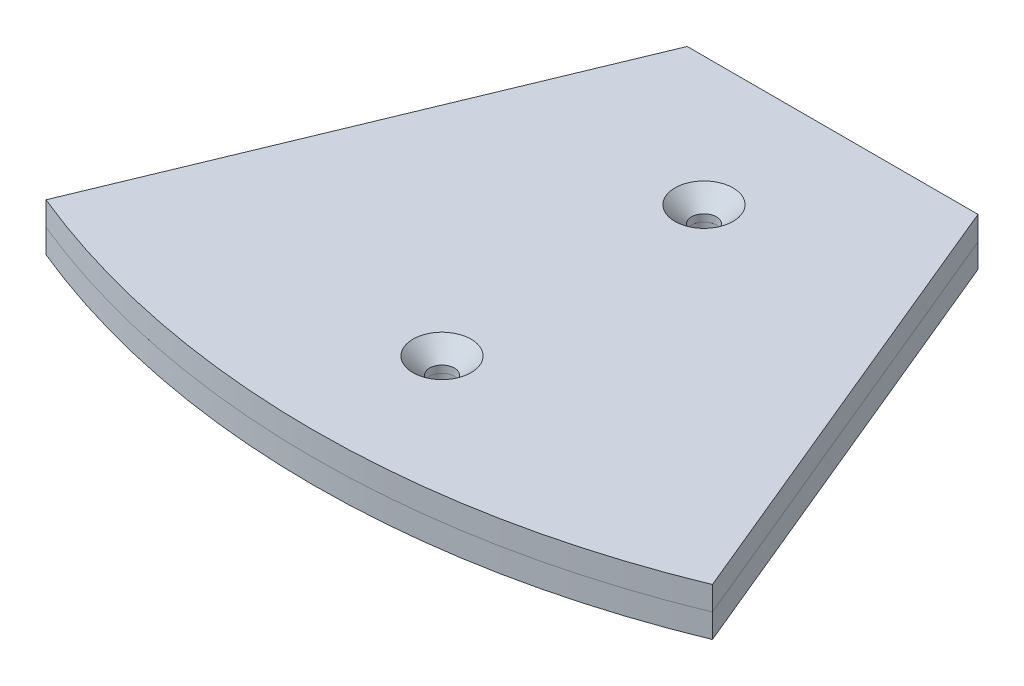
ISO-10303-21;
HEADER;
FILE_DESCRIPTION(('STEP AP214'),'2;1');
FILE_NAME('part.step','',(''),(''),'','','');
FILE_SCHEMA(('AUTOMOTIVE_DESIGN { 1 0 10303 214 1 1 1 1 }'));
ENDSEC;
DATA;
#1=APPLICATION_CONTEXT('core data for automotive mechanical design processes');
#2=APPLICATION_PROTOCOL_DEFINITION('international standard','automotive_design',2000,#1);
#3=PRODUCT_CONTEXT('',#1,'mechanical');
#4=PRODUCT('Part','Part','',(#3));
#5=PRODUCT_RELATED_PRODUCT_CATEGORY('part','',(#4));
#6=PRODUCT_DEFINITION_FORMATION('','',#4);
#7=PRODUCT_DEFINITION_CONTEXT('part definition',#1,'design');
#8=PRODUCT_DEFINITION('design','',#6,#7);
#9=PRODUCT_DEFINITION_SHAPE('','',#8);
#10=(LENGTH_UNIT() NAMED_UNIT(*) SI_UNIT(.MILLI.,.METRE.));
#11=(NAMED_UNIT(*) PLANE_ANGLE_UNIT() SI_UNIT($,.RADIAN.));
#12=(NAMED_UNIT(*) SI_UNIT($,.STERADIAN.) SOLID_ANGLE_UNIT());
#13=UNCERTAINTY_MEASURE_WITH_UNIT(LENGTH_MEASURE(1.E-05),#10,'distance_accuracy_value','');
#14=(GEOMETRIC_REPRESENTATION_CONTEXT(3) GLOBAL_UNCERTAINTY_ASSIGNED_CONTEXT((#13)) GLOBAL_UNIT_ASSIGNED_CONTEXT((#10,
#11,#12)) REPRESENTATION_CONTEXT('',''));
#15=CARTESIAN_POINT('',(0.,0.,0.));
#16=DIRECTION('',(0.,0.,1.));
#17=DIRECTION('',(1.,0.,0.));
#18=AXIS2_PLACEMENT_3D('',#15,#16,#17);
#19=CARTESIAN_POINT('',(0.,4.99,0.));
#20=DIRECTION('',(0.,-1.,0.));
#21=DIRECTION('',(0.,0.,-1.));
#22=AXIS2_PLACEMENT_3D('',#19,#20,#21);
#23=PLANE('',#22);
#24=DIRECTION('',(-1.,0.,0.));
#25=VECTOR('',#24,1.);
#26=CARTESIAN_POINT('',(0.,4.99,75.));
#27=LINE('',#26,#25);
#28=CARTESIAN_POINT('',(30.5248210778354,4.99,75.));
#29=VERTEX_POINT('',#28);
#30=CARTESIAN_POINT('',(-30.5248210778353,4.99,75.));
#31=VERTEX_POINT('',#30);
#32=EDGE_CURVE('E62',#29,#31,#27,.T.);
#33=ORIENTED_EDGE('',*,*,#32,.F.);
#34=DIRECTION('',(0.382683432365084,0.,0.923879532511289));
#35=VECTOR('',#34,1.);
#36=CARTESIAN_POINT('',(28.2386798483182,4.99,69.4807668381991));
#37=LINE('',#36,#35);
#38=CARTESIAN_POINT('',(69.951551813282,4.99,170.184548061549));
#39=VERTEX_POINT('',#38);
#40=EDGE_CURVE('E107',#29,#39,#37,.T.);
#41=ORIENTED_EDGE('',*,*,#40,.T.);
#42=CARTESIAN_POINT('',(0.,4.99,0.));
#43=DIRECTION('',(0.,-1.,0.));
#44=DIRECTION('',(0.,0.,-1.));
#45=AXIS2_PLACEMENT_3D('',#42,#43,#44);
#46=CIRCLE('',#45,184.);
#47=CARTESIAN_POINT('',(-69.9515518132819,4.99,170.184548061549));
#48=VERTEX_POINT('',#47);
#49=EDGE_CURVE('E71',#39,#48,#46,.T.);
#50=ORIENTED_EDGE('',*,*,#49,.T.);
#51=DIRECTION('',(0.382683432365084,0.,-0.923879532511289));
#52=VECTOR('',#51,1.);
#53=CARTESIAN_POINT('',(-28.2386798483181,4.99,69.4807668381991));
#54=LINE('',#53,#52);
#55=EDGE_CURVE('E101',#48,#31,#54,.T.);
#56=ORIENTED_EDGE('',*,*,#55,.T.);
#57=EDGE_LOOP('',(#33,#41,#50,#56));
#58=FACE_BOUND('',#57,.T.);
#59=CARTESIAN_POINT('',(0.,4.99,157.));
#60=DIRECTION('',(0.,-1.,0.));
#61=DIRECTION('',(0.,0.,-1.));
#62=AXIS2_PLACEMENT_3D('',#59,#60,#61);
#63=CIRCLE('',#62,2.59999999999998);
#64=CARTESIAN_POINT('',(0.,4.99,154.4));
#65=VERTEX_POINT('',#64);
#66=EDGE_CURVE('E173',#65,#65,#63,.T.);
#67=ORIENTED_EDGE('',*,*,#66,.F.);
#68=EDGE_LOOP('',(#67));
#69=FACE_BOUND('',#68,.T.);
#70=CARTESIAN_POINT('',(0.,4.99,102.));
#71=DIRECTION('',(0.,-1.,0.));
#72=DIRECTION('',(0.,0.,1.));
#73=AXIS2_PLACEMENT_3D('',#70,#71,#72);
#74=CIRCLE('',#73,2.59999999999998);
#75=CARTESIAN_POINT('',(0.,4.99,104.6));
#76=VERTEX_POINT('',#75);
#77=EDGE_CURVE('E169',#76,#76,#74,.T.);
#78=ORIENTED_EDGE('',*,*,#77,.F.);
#79=EDGE_LOOP('',(#78));
#80=FACE_BOUND('',#79,.T.);
#81=ADVANCED_FACE('F46',(#58,#69,#80),#23,.T.);
#82=CARTESIAN_POINT('',(0.,9.99,0.));
#83=DIRECTION('',(0.,-1.,0.));
#84=DIRECTION('',(0.,0.,-1.));
#85=AXIS2_PLACEMENT_3D('',#82,#83,#84);
#86=PLANE('',#85);
#87=CARTESIAN_POINT('',(0.,9.99,102.));
#88=DIRECTION('',(0.,-1.,0.));
#89=DIRECTION('',(0.,0.,-1.));
#90=AXIS2_PLACEMENT_3D('',#87,#88,#89);
#91=CIRCLE('',#90,6.10000000000002);
#92=CARTESIAN_POINT('',(0.,9.99,95.9));
#93=VERTEX_POINT('',#92);
#94=EDGE_CURVE('E116',#93,#93,#91,.T.);
#95=ORIENTED_EDGE('',*,*,#94,.T.);
#96=EDGE_LOOP('',(#95));
#97=FACE_BOUND('',#96,.T.);
#98=CARTESIAN_POINT('',(0.,9.99,157.));
#99=DIRECTION('',(0.,-1.,0.));
#100=DIRECTION('',(0.,0.,-1.));
#101=AXIS2_PLACEMENT_3D('',#98,#99,#100);
#102=CIRCLE('',#101,6.09999999999999);
#103=CARTESIAN_POINT('',(0.,9.99,150.9));
#104=VERTEX_POINT('',#103);
#105=EDGE_CURVE('E113',#104,#104,#102,.T.);
#106=ORIENTED_EDGE('',*,*,#105,.T.);
#107=EDGE_LOOP('',(#106));
#108=FACE_BOUND('',#107,.T.);
#109=DIRECTION('',(0.382683432365084,0.,0.923879532511289));
#110=VECTOR('',#109,1.);
#111=CARTESIAN_POINT('',(28.2386798483182,9.99,69.4807668381991));
#112=LINE('',#111,#110);
#113=CARTESIAN_POINT('',(30.5248210778354,9.99,75.));
#114=VERTEX_POINT('',#113);
#115=CARTESIAN_POINT('',(69.951551813282,9.99,170.184548061549));
#116=VERTEX_POINT('',#115);
#117=EDGE_CURVE('E95',#114,#116,#112,.T.);
#118=ORIENTED_EDGE('',*,*,#117,.F.);
#119=DIRECTION('',(-1.,0.,0.));
#120=VECTOR('',#119,1.);
#121=CARTESIAN_POINT('',(-30.5248210778353,9.99,75.));
#122=LINE('',#121,#120);
#123=CARTESIAN_POINT('',(-30.5248210778353,9.99,75.));
#124=VERTEX_POINT('',#123);
#125=EDGE_CURVE('E106',#114,#124,#122,.T.);
#126=ORIENTED_EDGE('',*,*,#125,.T.);
#127=DIRECTION('',(0.382683432365084,0.,-0.923879532511289));
#128=VECTOR('',#127,1.);
#129=CARTESIAN_POINT('',(-28.2386798483181,9.99,69.4807668381991));
#130=LINE('',#129,#128);
#131=CARTESIAN_POINT('',(-69.9515518132819,9.99,170.184548061549));
#132=VERTEX_POINT('',#131);
#133=EDGE_CURVE('E94',#132,#124,#130,.T.);
#134=ORIENTED_EDGE('',*,*,#133,.F.);
#135=CARTESIAN_POINT('',(0.,9.99,0.));
#136=DIRECTION('',(0.,-1.,0.));
#137=DIRECTION('',(0.,0.,-1.));
#138=AXIS2_PLACEMENT_3D('',#135,#136,#137);
#139=CIRCLE('',#138,184.);
#140=EDGE_CURVE('E84',#116,#132,#139,.T.);
#141=ORIENTED_EDGE('',*,*,#140,.F.);
#142=EDGE_LOOP('',(#118,#126,#134,#141));
#143=FACE_BOUND('',#142,.T.);
#144=ADVANCED_FACE('F104',(#97,#108,#143),#86,.F.);
#145=CARTESIAN_POINT('',(28.2386798483182,4.99,69.4807668381991));
#146=DIRECTION('',(-0.923879532511289,0.,0.382683432365084));
#147=DIRECTION('',(0.382683432365084,0.,0.923879532511289));
#148=AXIS2_PLACEMENT_3D('',#145,#146,#147);
#149=PLANE('',#148);
#150=ORIENTED_EDGE('',*,*,#40,.F.);
#151=DIRECTION('',(0.,-1.,0.));
#152=VECTOR('',#151,1.);
#153=CARTESIAN_POINT('',(30.5248210778354,9.99,75.));
#154=LINE('',#153,#152);
#155=EDGE_CURVE('E168',#114,#29,#154,.T.);
#156=ORIENTED_EDGE('',*,*,#155,.F.);
#157=ORIENTED_EDGE('',*,*,#117,.T.);
#158=DIRECTION('',(0.,1.,0.));
#159=VECTOR('',#158,1.);
#160=CARTESIAN_POINT('',(69.951551813282,4.99,170.184548061549));
#161=LINE('',#160,#159);
#162=EDGE_CURVE('E90',#39,#116,#161,.T.);
#163=ORIENTED_EDGE('',*,*,#162,.F.);
#164=EDGE_LOOP('',(#150,#156,#157,#163));
#165=FACE_BOUND('',#164,.T.);
#166=ADVANCED_FACE('F131',(#165),#149,.F.);
#167=CARTESIAN_POINT('',(0.,4.99,0.));
#168=DIRECTION('',(0.,1.,0.));
#169=DIRECTION('',(0.,0.,1.));
#170=AXIS2_PLACEMENT_3D('',#167,#168,#169);
#171=CYLINDRICAL_SURFACE('',#170,184.);
#172=ORIENTED_EDGE('',*,*,#140,.T.);
#173=DIRECTION('',(0.,1.,0.));
#174=VECTOR('',#173,1.);
#175=CARTESIAN_POINT('',(-69.9515518132819,4.99,170.184548061549));
#176=LINE('',#175,#174);
#177=EDGE_CURVE('E87',#48,#132,#176,.T.);
#178=ORIENTED_EDGE('',*,*,#177,.F.);
#179=ORIENTED_EDGE('',*,*,#49,.F.);
#180=ORIENTED_EDGE('',*,*,#162,.T.);
#181=EDGE_LOOP('',(#172,#178,#179,#180));
#182=FACE_BOUND('',#181,.T.);
#183=ADVANCED_FACE('F86',(#182),#171,.T.);
#184=CARTESIAN_POINT('',(-28.2386798483181,4.99,69.4807668381991));
#185=DIRECTION('',(0.923879532511289,0.,0.382683432365084));
#186=DIRECTION('',(0.382683432365084,0.,-0.923879532511289));
#187=AXIS2_PLACEMENT_3D('',#184,#185,#186);
#188=PLANE('',#187);
#189=ORIENTED_EDGE('',*,*,#133,.T.);
#190=DIRECTION('',(0.,-1.,0.));
#191=VECTOR('',#190,1.);
#192=CARTESIAN_POINT('',(-30.5248210778353,9.99,75.));
#193=LINE('',#192,#191);
#194=EDGE_CURVE('E170',#124,#31,#193,.T.);
#195=ORIENTED_EDGE('',*,*,#194,.T.);
#196=ORIENTED_EDGE('',*,*,#55,.F.);
#197=ORIENTED_EDGE('',*,*,#177,.T.);
#198=EDGE_LOOP('',(#189,#195,#196,#197));
#199=FACE_BOUND('',#198,.T.);
#200=ADVANCED_FACE('F99',(#199),#188,.F.);
#201=CARTESIAN_POINT('',(0.,4.99,157.));
#202=DIRECTION('',(0.,1.,0.));
#203=DIRECTION('',(0.,0.,1.));
#204=AXIS2_PLACEMENT_3D('',#201,#202,#203);
#205=CYLINDRICAL_SURFACE('',#204,2.59999999999998);
#206=CARTESIAN_POINT('',(0.,6.48999999999998,157.));
#207=DIRECTION('',(0.,-1.,0.));
#208=DIRECTION('',(0.,0.,-1.));
#209=AXIS2_PLACEMENT_3D('',#206,#207,#208);
#210=CIRCLE('',#209,2.59999999999998);
#211=CARTESIAN_POINT('',(0.,6.48999999999998,154.4));
#212=VERTEX_POINT('',#211);
#213=EDGE_CURVE('E12',#212,#212,#210,.F.);
#214=ORIENTED_EDGE('',*,*,#213,.T.);
#215=EDGE_LOOP('',(#214));
#216=FACE_BOUND('',#215,.T.);
#217=ORIENTED_EDGE('',*,*,#66,.T.);
#218=EDGE_LOOP('',(#217));
#219=FACE_BOUND('',#218,.T.);
#220=ADVANCED_FACE('F149',(#216,#219),#205,.F.);
#221=CARTESIAN_POINT('',(0.,4.99,102.));
#222=DIRECTION('',(0.,1.,0.));
#223=DIRECTION('',(0.,0.,1.));
#224=AXIS2_PLACEMENT_3D('',#221,#222,#223);
#225=CYLINDRICAL_SURFACE('',#224,2.59999999999998);
#226=CARTESIAN_POINT('',(0.,6.48999999999998,102.));
#227=DIRECTION('',(0.,-1.,0.));
#228=DIRECTION('',(0.,0.,-1.));
#229=AXIS2_PLACEMENT_3D('',#226,#227,#228);
#230=CIRCLE('',#229,2.59999999999998);
#231=CARTESIAN_POINT('',(0.,6.48999999999998,99.4));
#232=VERTEX_POINT('',#231);
#233=EDGE_CURVE('E55',#232,#232,#230,.F.);
#234=ORIENTED_EDGE('',*,*,#233,.T.);
#235=EDGE_LOOP('',(#234));
#236=FACE_BOUND('',#235,.T.);
#237=ORIENTED_EDGE('',*,*,#77,.T.);
#238=EDGE_LOOP('',(#237));
#239=FACE_BOUND('',#238,.T.);
#240=ADVANCED_FACE('F121',(#236,#239),#225,.F.);
#241=CARTESIAN_POINT('',(0.,9.99,102.));
#242=DIRECTION('',(0.,1.,0.));
#243=DIRECTION('',(0.,0.,1.));
#244=AXIS2_PLACEMENT_3D('',#241,#242,#243);
#245=CONICAL_SURFACE('',#244,6.10000000000002,0.78539816339745);
#246=ORIENTED_EDGE('',*,*,#233,.F.);
#247=EDGE_LOOP('',(#246));
#248=FACE_BOUND('',#247,.T.);
#249=ORIENTED_EDGE('',*,*,#94,.F.);
#250=EDGE_LOOP('',(#249));
#251=FACE_BOUND('',#250,.T.);
#252=ADVANCED_FACE('F124',(#248,#251),#245,.F.);
#253=CARTESIAN_POINT('',(0.,9.99,157.));
#254=DIRECTION('',(0.,1.,0.));
#255=DIRECTION('',(0.,0.,1.));
#256=AXIS2_PLACEMENT_3D('',#253,#254,#255);
#257=CONICAL_SURFACE('',#256,6.09999999999999,0.785398163397447);
#258=ORIENTED_EDGE('',*,*,#213,.F.);
#259=EDGE_LOOP('',(#258));
#260=FACE_BOUND('',#259,.T.);
#261=ORIENTED_EDGE('',*,*,#105,.F.);
#262=EDGE_LOOP('',(#261));
#263=FACE_BOUND('',#262,.T.);
#264=ADVANCED_FACE('F49',(#260,#263),#257,.F.);
#265=CARTESIAN_POINT('',(-30.5248210778353,9.99,75.));
#266=DIRECTION('',(0.,0.,1.));
#267=DIRECTION('',(1.,0.,0.));
#268=AXIS2_PLACEMENT_3D('',#265,#266,#267);
#269=PLANE('',#268);
#270=ORIENTED_EDGE('',*,*,#32,.T.);
#271=ORIENTED_EDGE('',*,*,#194,.F.);
#272=ORIENTED_EDGE('',*,*,#125,.F.);
#273=ORIENTED_EDGE('',*,*,#155,.T.);
#274=EDGE_LOOP('',(#270,#271,#272,#273));
#275=FACE_BOUND('',#274,.T.);
#276=ADVANCED_FACE('F136',(#275),#269,.F.);
#277=CLOSED_SHELL('',(#81,#144,#166,#183,#200,#220,#240,#252,#264,#276));
#278=MANIFOLD_SOLID_BREP('B2',#277);
#279=CARTESIAN_POINT('',(0.,-0.00999999999999959,0.));
#280=DIRECTION('',(0.,-1.,0.));
#281=DIRECTION('',(0.,0.,-1.));
#282=AXIS2_PLACEMENT_3D('',#279,#280,#281);
#283=PLANE('',#282);
#284=DIRECTION('',(-1.,0.,0.));
#285=VECTOR('',#284,1.);
#286=CARTESIAN_POINT('',(-30.5248210778353,-0.00999999999999959,75.));
#287=LINE('',#286,#285);
#288=CARTESIAN_POINT('',(30.5248210778354,-0.00999999999999959,75.));
#289=VERTEX_POINT('',#288);
#290=CARTESIAN_POINT('',(-30.5248210778353,-0.00999999999999959,75.));
#291=VERTEX_POINT('',#290);
#292=EDGE_CURVE('E263',#289,#291,#287,.T.);
#293=ORIENTED_EDGE('',*,*,#292,.F.);
#294=DIRECTION('',(0.382683432365084,0.,0.923879532511289));
#295=VECTOR('',#294,1.);
#296=CARTESIAN_POINT('',(28.2386798483182,-0.00999999999999959,69.4807668381991));
#297=LINE('',#296,#295);
#298=CARTESIAN_POINT('',(69.951551813282,-0.00999999999999959,170.184548061549));
#299=VERTEX_POINT('',#298);
#300=EDGE_CURVE('E307',#289,#299,#297,.T.);
#301=ORIENTED_EDGE('',*,*,#300,.T.);
#302=CARTESIAN_POINT('',(0.,-0.00999999999999959,0.));
#303=DIRECTION('',(0.,-1.,0.));
#304=DIRECTION('',(0.,0.,-1.));
#305=AXIS2_PLACEMENT_3D('',#302,#303,#304);
#306=CIRCLE('',#305,184.);
#307=CARTESIAN_POINT('',(-69.9515518132819,-0.00999999999999959,170.184548061549));
#308=VERTEX_POINT('',#307);
#309=EDGE_CURVE('E271',#299,#308,#306,.T.);
#310=ORIENTED_EDGE('',*,*,#309,.T.);
#311=DIRECTION('',(0.382683432365084,0.,-0.923879532511289));
#312=VECTOR('',#311,1.);
#313=CARTESIAN_POINT('',(-69.9515518132819,-0.00999999999999959,170.184548061549));
#314=LINE('',#313,#312);
#315=EDGE_CURVE('E300',#308,#291,#314,.T.);
#316=ORIENTED_EDGE('',*,*,#315,.T.);
#317=EDGE_LOOP('',(#293,#301,#310,#316));
#318=FACE_BOUND('',#317,.T.);
#319=CARTESIAN_POINT('',(0.,-0.00999999999999959,102.));
#320=DIRECTION('',(0.,-1.,0.));
#321=DIRECTION('',(0.,0.,-1.));
#322=AXIS2_PLACEMENT_3D('',#319,#320,#321);
#323=CIRCLE('',#322,6.10000000000002);
#324=CARTESIAN_POINT('',(0.,-0.00999999999999959,95.9));
#325=VERTEX_POINT('',#324);
#326=EDGE_CURVE('E319',#325,#325,#323,.F.);
#327=ORIENTED_EDGE('',*,*,#326,.T.);
#328=EDGE_LOOP('',(#327));
#329=FACE_BOUND('',#328,.T.);
#330=CARTESIAN_POINT('',(0.,-0.00999999999999959,157.));
#331=DIRECTION('',(0.,-1.,0.));
#332=DIRECTION('',(0.,0.,-1.));
#333=AXIS2_PLACEMENT_3D('',#330,#331,#332);
#334=CIRCLE('',#333,6.09999999999999);
#335=CARTESIAN_POINT('',(0.,-0.00999999999999959,150.9));
#336=VERTEX_POINT('',#335);
#337=EDGE_CURVE('E316',#336,#336,#334,.F.);
#338=ORIENTED_EDGE('',*,*,#337,.T.);
#339=EDGE_LOOP('',(#338));
#340=FACE_BOUND('',#339,.T.);
#341=ADVANCED_FACE('F247',(#318,#329,#340),#283,.T.);
#342=CARTESIAN_POINT('',(0.,4.99,0.));
#343=DIRECTION('',(0.,-1.,0.));
#344=DIRECTION('',(0.,0.,-1.));
#345=AXIS2_PLACEMENT_3D('',#342,#343,#344);
#346=PLANE('',#345);
#347=DIRECTION('',(0.382683432365084,0.,0.923879532511289));
#348=VECTOR('',#347,1.);
#349=CARTESIAN_POINT('',(28.2386798483182,4.99,69.4807668381991));
#350=LINE('',#349,#348);
#351=CARTESIAN_POINT('',(30.5248210778354,4.99,75.));
#352=VERTEX_POINT('',#351);
#353=CARTESIAN_POINT('',(69.951551813282,4.99,170.184548061549));
#354=VERTEX_POINT('',#353);
#355=EDGE_CURVE('E295',#352,#354,#350,.T.);
#356=ORIENTED_EDGE('',*,*,#355,.F.);
#357=DIRECTION('',(-1.,0.,0.));
#358=VECTOR('',#357,1.);
#359=CARTESIAN_POINT('',(0.,4.99,75.));
#360=LINE('',#359,#358);
#361=CARTESIAN_POINT('',(-30.5248210778353,4.99,75.));
#362=VERTEX_POINT('',#361);
#363=EDGE_CURVE('E306',#352,#362,#360,.T.);
#364=ORIENTED_EDGE('',*,*,#363,.T.);
#365=DIRECTION('',(0.382683432365084,0.,-0.923879532511289));
#366=VECTOR('',#365,1.);
#367=CARTESIAN_POINT('',(-69.9515518132819,4.99,170.184548061549));
#368=LINE('',#367,#366);
#369=CARTESIAN_POINT('',(-69.9515518132819,4.99,170.184548061549));
#370=VERTEX_POINT('',#369);
#371=EDGE_CURVE('E294',#370,#362,#368,.T.);
#372=ORIENTED_EDGE('',*,*,#371,.F.);
#373=CARTESIAN_POINT('',(0.,4.99,0.));
#374=DIRECTION('',(0.,-1.,0.));
#375=DIRECTION('',(0.,0.,-1.));
#376=AXIS2_PLACEMENT_3D('',#373,#374,#375);
#377=CIRCLE('',#376,184.);
#378=EDGE_CURVE('E284',#354,#370,#377,.T.);
#379=ORIENTED_EDGE('',*,*,#378,.F.);
#380=EDGE_LOOP('',(#356,#364,#372,#379));
#381=FACE_BOUND('',#380,.T.);
#382=CARTESIAN_POINT('',(0.,4.99,102.));
#383=DIRECTION('',(0.,-1.,0.));
#384=DIRECTION('',(0.,0.,-1.));
#385=AXIS2_PLACEMENT_3D('',#382,#383,#384);
#386=CIRCLE('',#385,2.59999999999999);
#387=CARTESIAN_POINT('',(0.,4.99,99.4));
#388=VERTEX_POINT('',#387);
#389=EDGE_CURVE('E376',#388,#388,#386,.T.);
#390=ORIENTED_EDGE('',*,*,#389,.T.);
#391=EDGE_LOOP('',(#390));
#392=FACE_BOUND('',#391,.T.);
#393=CARTESIAN_POINT('',(0.,4.99,157.));
#394=DIRECTION('',(0.,-1.,0.));
#395=DIRECTION('',(0.,0.,-1.));
#396=AXIS2_PLACEMENT_3D('',#393,#394,#395);
#397=CIRCLE('',#396,2.59999999999999);
#398=CARTESIAN_POINT('',(0.,4.99,154.4));
#399=VERTEX_POINT('',#398);
#400=EDGE_CURVE('E371',#399,#399,#397,.T.);
#401=ORIENTED_EDGE('',*,*,#400,.T.);
#402=EDGE_LOOP('',(#401));
#403=FACE_BOUND('',#402,.T.);
#404=ADVANCED_FACE('F303',(#381,#392,#403),#346,.F.);
#405=CARTESIAN_POINT('',(28.2386798483182,-0.00999999999999959,69.4807668381991));
#406=DIRECTION('',(-0.923879532511289,0.,0.382683432365084));
#407=DIRECTION('',(0.382683432365084,0.,0.923879532511289));
#408=AXIS2_PLACEMENT_3D('',#405,#406,#407);
#409=PLANE('',#408);
#410=ORIENTED_EDGE('',*,*,#300,.F.);
#411=DIRECTION('',(0.,-1.,0.));
#412=VECTOR('',#411,1.);
#413=CARTESIAN_POINT('',(30.5248210778354,9.99,75.));
#414=LINE('',#413,#412);
#415=EDGE_CURVE('E367',#352,#289,#414,.T.);
#416=ORIENTED_EDGE('',*,*,#415,.F.);
#417=ORIENTED_EDGE('',*,*,#355,.T.);
#418=DIRECTION('',(0.,1.,0.));
#419=VECTOR('',#418,1.);
#420=CARTESIAN_POINT('',(69.951551813282,-0.00999999999999959,170.184548061549));
#421=LINE('',#420,#419);
#422=EDGE_CURVE('E290',#299,#354,#421,.T.);
#423=ORIENTED_EDGE('',*,*,#422,.F.);
#424=EDGE_LOOP('',(#410,#416,#417,#423));
#425=FACE_BOUND('',#424,.T.);
#426=ADVANCED_FACE('F343',(#425),#409,.F.);
#427=CARTESIAN_POINT('',(0.,-0.00999999999999959,0.));
#428=DIRECTION('',(0.,1.,0.));
#429=DIRECTION('',(0.,0.,1.));
#430=AXIS2_PLACEMENT_3D('',#427,#428,#429);
#431=CYLINDRICAL_SURFACE('',#430,184.);
#432=ORIENTED_EDGE('',*,*,#378,.T.);
#433=DIRECTION('',(0.,1.,0.));
#434=VECTOR('',#433,1.);
#435=CARTESIAN_POINT('',(-69.9515518132819,-0.00999999999999959,170.184548061549));
#436=LINE('',#435,#434);
#437=EDGE_CURVE('E287',#308,#370,#436,.T.);
#438=ORIENTED_EDGE('',*,*,#437,.F.);
#439=ORIENTED_EDGE('',*,*,#309,.F.);
#440=ORIENTED_EDGE('',*,*,#422,.T.);
#441=EDGE_LOOP('',(#432,#438,#439,#440));
#442=FACE_BOUND('',#441,.T.);
#443=ADVANCED_FACE('F286',(#442),#431,.T.);
#444=CARTESIAN_POINT('',(-69.9515518132819,-0.00999999999999959,170.184548061549));
#445=DIRECTION('',(0.923879532511289,0.,0.382683432365084));
#446=DIRECTION('',(0.382683432365084,0.,-0.923879532511289));
#447=AXIS2_PLACEMENT_3D('',#444,#445,#446);
#448=PLANE('',#447);
#449=ORIENTED_EDGE('',*,*,#371,.T.);
#450=DIRECTION('',(0.,-1.,0.));
#451=VECTOR('',#450,1.);
#452=CARTESIAN_POINT('',(-30.5248210778353,-0.00999999999999959,75.));
#453=LINE('',#452,#451);
#454=EDGE_CURVE('E44',#362,#291,#453,.T.);
#455=ORIENTED_EDGE('',*,*,#454,.T.);
#456=ORIENTED_EDGE('',*,*,#315,.F.);
#457=ORIENTED_EDGE('',*,*,#437,.T.);
#458=EDGE_LOOP('',(#449,#455,#456,#457));
#459=FACE_BOUND('',#458,.T.);
#460=ADVANCED_FACE('F299',(#459),#448,.F.);
#461=CARTESIAN_POINT('',(0.,-0.00999999999999959,102.));
#462=DIRECTION('',(0.,1.,0.));
#463=DIRECTION('',(0.,0.,1.));
#464=AXIS2_PLACEMENT_3D('',#461,#462,#463);
#465=CYLINDRICAL_SURFACE('',#464,2.59999999999999);
#466=CARTESIAN_POINT('',(0.,3.49000000000001,102.));
#467=DIRECTION('',(0.,-1.,0.));
#468=DIRECTION('',(0.,0.,-1.));
#469=AXIS2_PLACEMENT_3D('',#466,#467,#468);
#470=CIRCLE('',#469,2.59999999999999);
#471=CARTESIAN_POINT('',(0.,3.49000000000001,99.4));
#472=VERTEX_POINT('',#471);
#473=EDGE_CURVE('E313',#472,#472,#470,.T.);
#474=ORIENTED_EDGE('',*,*,#473,.T.);
#475=EDGE_LOOP('',(#474));
#476=FACE_BOUND('',#475,.T.);
#477=ORIENTED_EDGE('',*,*,#389,.F.);
#478=EDGE_LOOP('',(#477));
#479=FACE_BOUND('',#478,.T.);
#480=ADVANCED_FACE('F347',(#476,#479),#465,.F.);
#481=CARTESIAN_POINT('',(0.,-0.00999999999999959,157.));
#482=DIRECTION('',(0.,1.,0.));
#483=DIRECTION('',(0.,0.,1.));
#484=AXIS2_PLACEMENT_3D('',#481,#482,#483);
#485=CYLINDRICAL_SURFACE('',#484,2.59999999999999);
#486=CARTESIAN_POINT('',(0.,3.48999999999999,157.));
#487=DIRECTION('',(0.,-1.,0.));
#488=DIRECTION('',(0.,0.,-1.));
#489=AXIS2_PLACEMENT_3D('',#486,#487,#488);
#490=CIRCLE('',#489,2.59999999999999);
#491=CARTESIAN_POINT('',(0.,3.48999999999999,154.4));
#492=VERTEX_POINT('',#491);
#493=EDGE_CURVE('E256',#492,#492,#490,.T.);
#494=ORIENTED_EDGE('',*,*,#493,.T.);
#495=EDGE_LOOP('',(#494));
#496=FACE_BOUND('',#495,.T.);
#497=ORIENTED_EDGE('',*,*,#400,.F.);
#498=EDGE_LOOP('',(#497));
#499=FACE_BOUND('',#498,.T.);
#500=ADVANCED_FACE('F324',(#496,#499),#485,.F.);
#501=CARTESIAN_POINT('',(0.,3.49000000000001,102.));
#502=DIRECTION('',(0.,-1.,0.));
#503=DIRECTION('',(0.,0.,-1.));
#504=AXIS2_PLACEMENT_3D('',#501,#502,#503);
#505=CONICAL_SURFACE('',#504,2.59999999999999,0.785398163397451);
#506=ORIENTED_EDGE('',*,*,#326,.F.);
#507=EDGE_LOOP('',(#506));
#508=FACE_BOUND('',#507,.T.);
#509=ORIENTED_EDGE('',*,*,#473,.F.);
#510=EDGE_LOOP('',(#509));
#511=FACE_BOUND('',#510,.T.);
#512=ADVANCED_FACE('F329',(#508,#511),#505,.F.);
#513=CARTESIAN_POINT('',(0.,3.48999999999999,157.));
#514=DIRECTION('',(0.,-1.,0.));
#515=DIRECTION('',(0.,0.,-1.));
#516=AXIS2_PLACEMENT_3D('',#513,#514,#515);
#517=CONICAL_SURFACE('',#516,2.59999999999999,0.785398163397451);
#518=ORIENTED_EDGE('',*,*,#337,.F.);
#519=EDGE_LOOP('',(#518));
#520=FACE_BOUND('',#519,.T.);
#521=ORIENTED_EDGE('',*,*,#493,.F.);
#522=EDGE_LOOP('',(#521));
#523=FACE_BOUND('',#522,.T.);
#524=ADVANCED_FACE('F250',(#520,#523),#517,.F.);
#525=CARTESIAN_POINT('',(-30.5248210778353,9.99,75.));
#526=DIRECTION('',(0.,0.,1.));
#527=DIRECTION('',(1.,0.,0.));
#528=AXIS2_PLACEMENT_3D('',#525,#526,#527);
#529=PLANE('',#528);
#530=ORIENTED_EDGE('',*,*,#415,.T.);
#531=ORIENTED_EDGE('',*,*,#292,.T.);
#532=ORIENTED_EDGE('',*,*,#454,.F.);
#533=ORIENTED_EDGE('',*,*,#363,.F.);
#534=EDGE_LOOP('',(#530,#531,#532,#533));
#535=FACE_BOUND('',#534,.T.);
#536=ADVANCED_FACE('F328',(#535),#529,.F.);
#537=CLOSED_SHELL('',(#341,#404,#426,#443,#460,#480,#500,#512,#524,#536));
#538=MANIFOLD_SOLID_BREP('B6',#537);
#539=ADVANCED_BREP_SHAPE_REPRESENTATION('',(#18,#278,#538),#14);
#540=SHAPE_DEFINITION_REPRESENTATION(#9,#539);
ENDSEC;
END-ISO-10303-21;
